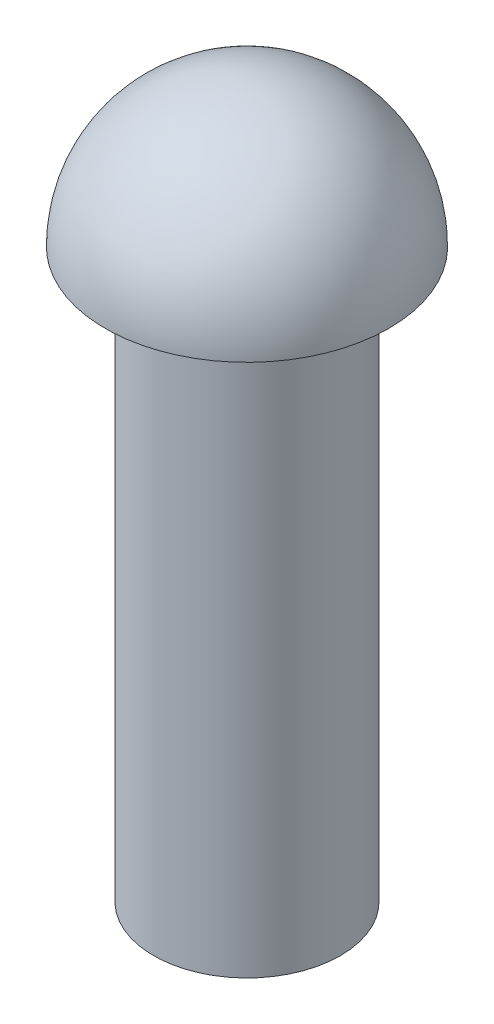
ISO-10303-21;
HEADER;
FILE_DESCRIPTION(('STEP AP214'),'2;1');
FILE_NAME('part.step','',(''),(''),'','','');
FILE_SCHEMA(('AUTOMOTIVE_DESIGN { 1 0 10303 214 1 1 1 1 }'));
ENDSEC;
DATA;
#1=APPLICATION_CONTEXT('core data for automotive mechanical design processes');
#2=APPLICATION_PROTOCOL_DEFINITION('international standard','automotive_design',2000,#1);
#3=PRODUCT_CONTEXT('',#1,'mechanical');
#4=PRODUCT('Part','Part','',(#3));
#5=PRODUCT_RELATED_PRODUCT_CATEGORY('part','',(#4));
#6=PRODUCT_DEFINITION_FORMATION('','',#4);
#7=PRODUCT_DEFINITION_CONTEXT('part definition',#1,'design');
#8=PRODUCT_DEFINITION('design','',#6,#7);
#9=PRODUCT_DEFINITION_SHAPE('','',#8);
#10=(LENGTH_UNIT() NAMED_UNIT(*) SI_UNIT(.MILLI.,.METRE.));
#11=(NAMED_UNIT(*) PLANE_ANGLE_UNIT() SI_UNIT($,.RADIAN.));
#12=(NAMED_UNIT(*) SI_UNIT($,.STERADIAN.) SOLID_ANGLE_UNIT());
#13=UNCERTAINTY_MEASURE_WITH_UNIT(LENGTH_MEASURE(1.E-05),#10,'distance_accuracy_value','');
#14=(GEOMETRIC_REPRESENTATION_CONTEXT(3) GLOBAL_UNCERTAINTY_ASSIGNED_CONTEXT((#13)) GLOBAL_UNIT_ASSIGNED_CONTEXT((#10,
#11,#12)) REPRESENTATION_CONTEXT('',''));
#15=CARTESIAN_POINT('',(0.,0.,0.));
#16=DIRECTION('',(0.,0.,1.));
#17=DIRECTION('',(1.,0.,0.));
#18=AXIS2_PLACEMENT_3D('',#15,#16,#17);
#19=CARTESIAN_POINT('',(0.,60.,0.));
#20=DIRECTION('',(0.,-1.,0.));
#21=DIRECTION('',(-1.,0.,0.));
#22=AXIS2_PLACEMENT_3D('',#19,#20,#21);
#23=SPHERICAL_SURFACE('',#22,15.);
#24=CARTESIAN_POINT('',(0.,60.,0.));
#25=DIRECTION('',(0.,-1.,0.));
#26=DIRECTION('',(1.,0.,0.));
#27=AXIS2_PLACEMENT_3D('',#24,#25,#26);
#28=CIRCLE('',#27,15.);
#29=CARTESIAN_POINT('',(15.,60.,0.));
#30=VERTEX_POINT('',#29);
#31=EDGE_CURVE('E10',#30,#30,#28,.T.);
#32=ORIENTED_EDGE('',*,*,#31,.F.);
#33=EDGE_LOOP('',(#32));
#34=FACE_BOUND('',#33,.T.);
#35=ADVANCED_FACE('F39',(#34),#23,.T.);
#36=CARTESIAN_POINT('',(-15.,60.,0.));
#37=DIRECTION('',(0.,1.,0.));
#38=DIRECTION('',(-1.,0.,0.));
#39=AXIS2_PLACEMENT_3D('',#36,#37,#38);
#40=PLANE('',#39);
#41=CARTESIAN_POINT('',(0.,60.,0.));
#42=DIRECTION('',(0.,-1.,0.));
#43=DIRECTION('',(1.,0.,0.));
#44=AXIS2_PLACEMENT_3D('',#41,#42,#43);
#45=CIRCLE('',#44,9.87341772151897);
#46=CARTESIAN_POINT('',(9.87341772151897,60.,0.));
#47=VERTEX_POINT('',#46);
#48=EDGE_CURVE('E46',#47,#47,#45,.T.);
#49=ORIENTED_EDGE('',*,*,#48,.F.);
#50=EDGE_LOOP('',(#49));
#51=FACE_BOUND('',#50,.T.);
#52=ORIENTED_EDGE('',*,*,#31,.T.);
#53=EDGE_LOOP('',(#52));
#54=FACE_BOUND('',#53,.T.);
#55=ADVANCED_FACE('F63',(#51,#54),#40,.F.);
#56=CARTESIAN_POINT('',(0.,60.,0.));
#57=DIRECTION('',(0.,-1.,0.));
#58=DIRECTION('',(1.,0.,0.));
#59=AXIS2_PLACEMENT_3D('',#56,#57,#58);
#60=CYLINDRICAL_SURFACE('',#59,9.87341772151897);
#61=ORIENTED_EDGE('',*,*,#48,.T.);
#62=EDGE_LOOP('',(#61));
#63=FACE_BOUND('',#62,.T.);
#64=CARTESIAN_POINT('',(0.,0.,0.));
#65=DIRECTION('',(0.,-1.,0.));
#66=DIRECTION('',(1.,0.,0.));
#67=AXIS2_PLACEMENT_3D('',#64,#65,#66);
#68=CIRCLE('',#67,9.87341772151897);
#69=CARTESIAN_POINT('',(9.87341772151896,0.,0.));
#70=VERTEX_POINT('',#69);
#71=EDGE_CURVE('E51',#70,#70,#68,.T.);
#72=ORIENTED_EDGE('',*,*,#71,.F.);
#73=EDGE_LOOP('',(#72));
#74=FACE_BOUND('',#73,.T.);
#75=ADVANCED_FACE('F61',(#63,#74),#60,.T.);
#76=CARTESIAN_POINT('',(0.,0.,0.));
#77=DIRECTION('',(0.,-1.,0.));
#78=DIRECTION('',(1.,0.,0.));
#79=AXIS2_PLACEMENT_3D('',#76,#77,#78);
#80=PLANE('',#79);
#81=ORIENTED_EDGE('',*,*,#71,.T.);
#82=EDGE_LOOP('',(#81));
#83=FACE_BOUND('',#82,.T.);
#84=ADVANCED_FACE('F59',(#83),#80,.T.);
#85=CLOSED_SHELL('',(#35,#55,#75,#84));
#86=MANIFOLD_SOLID_BREP('B2',#85);
#87=ADVANCED_BREP_SHAPE_REPRESENTATION('',(#18,#86),#14);
#88=SHAPE_DEFINITION_REPRESENTATION(#9,#87);
ENDSEC;
END-ISO-10303-21;
